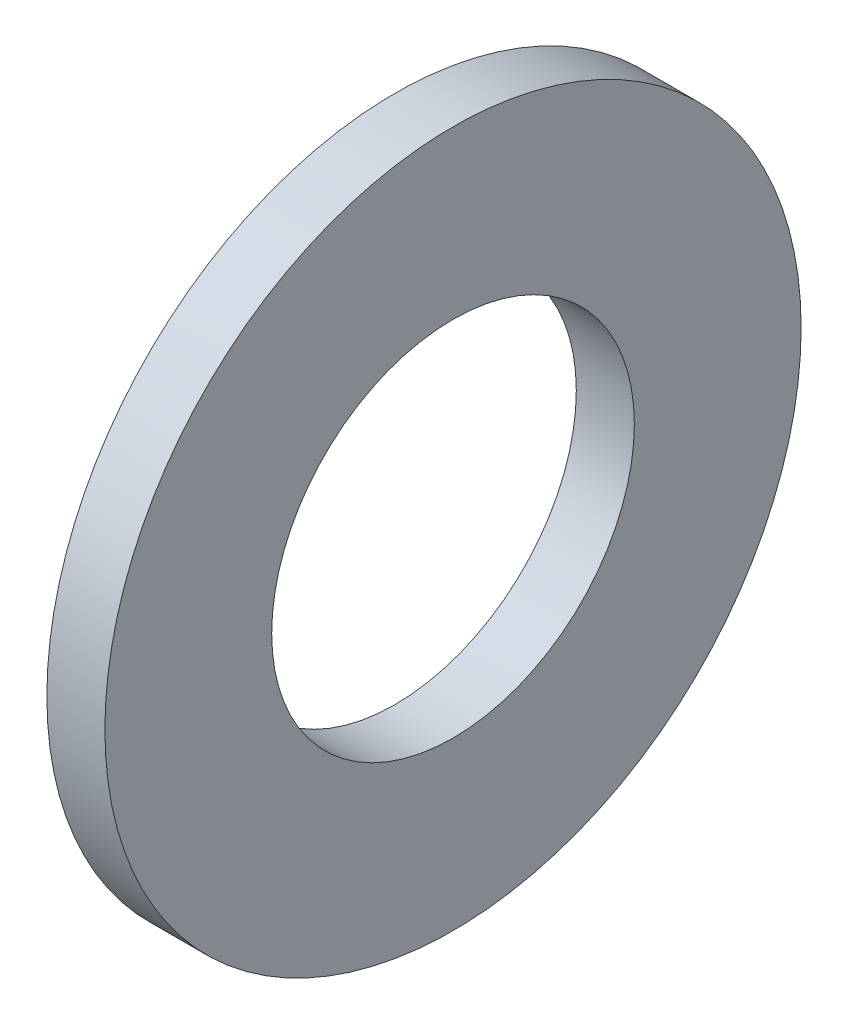
ISO-10303-21;
HEADER;
FILE_DESCRIPTION(('STEP AP214'),'2;1');
FILE_NAME('part.step','',(''),(''),'','','');
FILE_SCHEMA(('AUTOMOTIVE_DESIGN { 1 0 10303 214 1 1 1 1 }'));
ENDSEC;
DATA;
#1=APPLICATION_CONTEXT('core data for automotive mechanical design processes');
#2=APPLICATION_PROTOCOL_DEFINITION('international standard','automotive_design',2000,#1);
#3=PRODUCT_CONTEXT('',#1,'mechanical');
#4=PRODUCT('Part','Part','',(#3));
#5=PRODUCT_RELATED_PRODUCT_CATEGORY('part','',(#4));
#6=PRODUCT_DEFINITION_FORMATION('','',#4);
#7=PRODUCT_DEFINITION_CONTEXT('part definition',#1,'design');
#8=PRODUCT_DEFINITION('design','',#6,#7);
#9=PRODUCT_DEFINITION_SHAPE('','',#8);
#10=(LENGTH_UNIT() NAMED_UNIT(*) SI_UNIT(.MILLI.,.METRE.));
#11=(NAMED_UNIT(*) PLANE_ANGLE_UNIT() SI_UNIT($,.RADIAN.));
#12=(NAMED_UNIT(*) SI_UNIT($,.STERADIAN.) SOLID_ANGLE_UNIT());
#13=UNCERTAINTY_MEASURE_WITH_UNIT(LENGTH_MEASURE(1.E-05),#10,'distance_accuracy_value','');
#14=(GEOMETRIC_REPRESENTATION_CONTEXT(3) GLOBAL_UNCERTAINTY_ASSIGNED_CONTEXT((#13)) GLOBAL_UNIT_ASSIGNED_CONTEXT((#10,
#11,#12)) REPRESENTATION_CONTEXT('',''));
#15=CARTESIAN_POINT('',(0.,0.,0.));
#16=DIRECTION('',(0.,0.,1.));
#17=DIRECTION('',(1.,0.,0.));
#18=AXIS2_PLACEMENT_3D('',#15,#16,#17);
#19=CARTESIAN_POINT('',(0.5,0.,0.));
#20=DIRECTION('',(1.,0.,0.));
#21=DIRECTION('',(0.,0.,-1.));
#22=AXIS2_PLACEMENT_3D('',#19,#20,#21);
#23=PLANE('',#22);
#24=CARTESIAN_POINT('',(0.5,0.,0.));
#25=DIRECTION('',(1.,0.,0.));
#26=DIRECTION('',(0.,0.,-1.));
#27=AXIS2_PLACEMENT_3D('',#24,#25,#26);
#28=CIRCLE('',#27,6.);
#29=CARTESIAN_POINT('',(0.5,0.,-6.));
#30=VERTEX_POINT('',#29);
#31=EDGE_CURVE('E10',#30,#30,#28,.T.);
#32=ORIENTED_EDGE('',*,*,#31,.T.);
#33=EDGE_LOOP('',(#32));
#34=FACE_BOUND('',#33,.T.);
#35=CARTESIAN_POINT('',(0.5,0.,0.));
#36=DIRECTION('',(1.,0.,0.));
#37=DIRECTION('',(0.,0.,-1.));
#38=AXIS2_PLACEMENT_3D('',#35,#36,#37);
#39=CIRCLE('',#38,3.125);
#40=CARTESIAN_POINT('',(0.5,0.,-3.125));
#41=VERTEX_POINT('',#40);
#42=EDGE_CURVE('E42',#41,#41,#39,.T.);
#43=ORIENTED_EDGE('',*,*,#42,.F.);
#44=EDGE_LOOP('',(#43));
#45=FACE_BOUND('',#44,.T.);
#46=ADVANCED_FACE('F31',(#34,#45),#23,.T.);
#47=CARTESIAN_POINT('',(-0.5,0.,0.));
#48=DIRECTION('',(1.,0.,0.));
#49=DIRECTION('',(0.,0.,-1.));
#50=AXIS2_PLACEMENT_3D('',#47,#48,#49);
#51=PLANE('',#50);
#52=CARTESIAN_POINT('',(-0.5,0.,0.));
#53=DIRECTION('',(1.,0.,0.));
#54=DIRECTION('',(0.,0.,-1.));
#55=AXIS2_PLACEMENT_3D('',#52,#53,#54);
#56=CIRCLE('',#55,6.);
#57=CARTESIAN_POINT('',(-0.5,0.,-6.));
#58=VERTEX_POINT('',#57);
#59=EDGE_CURVE('E35',#58,#58,#56,.T.);
#60=ORIENTED_EDGE('',*,*,#59,.F.);
#61=EDGE_LOOP('',(#60));
#62=FACE_BOUND('',#61,.T.);
#63=CARTESIAN_POINT('',(-0.5,0.,0.));
#64=DIRECTION('',(1.,0.,0.));
#65=DIRECTION('',(0.,0.,-1.));
#66=AXIS2_PLACEMENT_3D('',#63,#64,#65);
#67=CIRCLE('',#66,3.125);
#68=CARTESIAN_POINT('',(-0.5,0.,-3.125));
#69=VERTEX_POINT('',#68);
#70=EDGE_CURVE('E44',#69,#69,#67,.T.);
#71=ORIENTED_EDGE('',*,*,#70,.T.);
#72=EDGE_LOOP('',(#71));
#73=FACE_BOUND('',#72,.T.);
#74=ADVANCED_FACE('F54',(#62,#73),#51,.F.);
#75=CARTESIAN_POINT('',(0.5,0.,0.));
#76=DIRECTION('',(-1.,0.,0.));
#77=DIRECTION('',(0.,0.,1.));
#78=AXIS2_PLACEMENT_3D('',#75,#76,#77);
#79=CYLINDRICAL_SURFACE('',#78,6.);
#80=ORIENTED_EDGE('',*,*,#31,.F.);
#81=EDGE_LOOP('',(#80));
#82=FACE_BOUND('',#81,.T.);
#83=ORIENTED_EDGE('',*,*,#59,.T.);
#84=EDGE_LOOP('',(#83));
#85=FACE_BOUND('',#84,.T.);
#86=ADVANCED_FACE('F33',(#82,#85),#79,.T.);
#87=CARTESIAN_POINT('',(0.5,0.,0.));
#88=DIRECTION('',(-1.,0.,0.));
#89=DIRECTION('',(0.,0.,1.));
#90=AXIS2_PLACEMENT_3D('',#87,#88,#89);
#91=CYLINDRICAL_SURFACE('',#90,3.125);
#92=ORIENTED_EDGE('',*,*,#42,.T.);
#93=EDGE_LOOP('',(#92));
#94=FACE_BOUND('',#93,.T.);
#95=ORIENTED_EDGE('',*,*,#70,.F.);
#96=EDGE_LOOP('',(#95));
#97=FACE_BOUND('',#96,.T.);
#98=ADVANCED_FACE('F50',(#94,#97),#91,.F.);
#99=CLOSED_SHELL('',(#46,#74,#86,#98));
#100=MANIFOLD_SOLID_BREP('B2',#99);
#101=ADVANCED_BREP_SHAPE_REPRESENTATION('',(#18,#100),#14);
#102=SHAPE_DEFINITION_REPRESENTATION(#9,#101);
ENDSEC;
END-ISO-10303-21;
